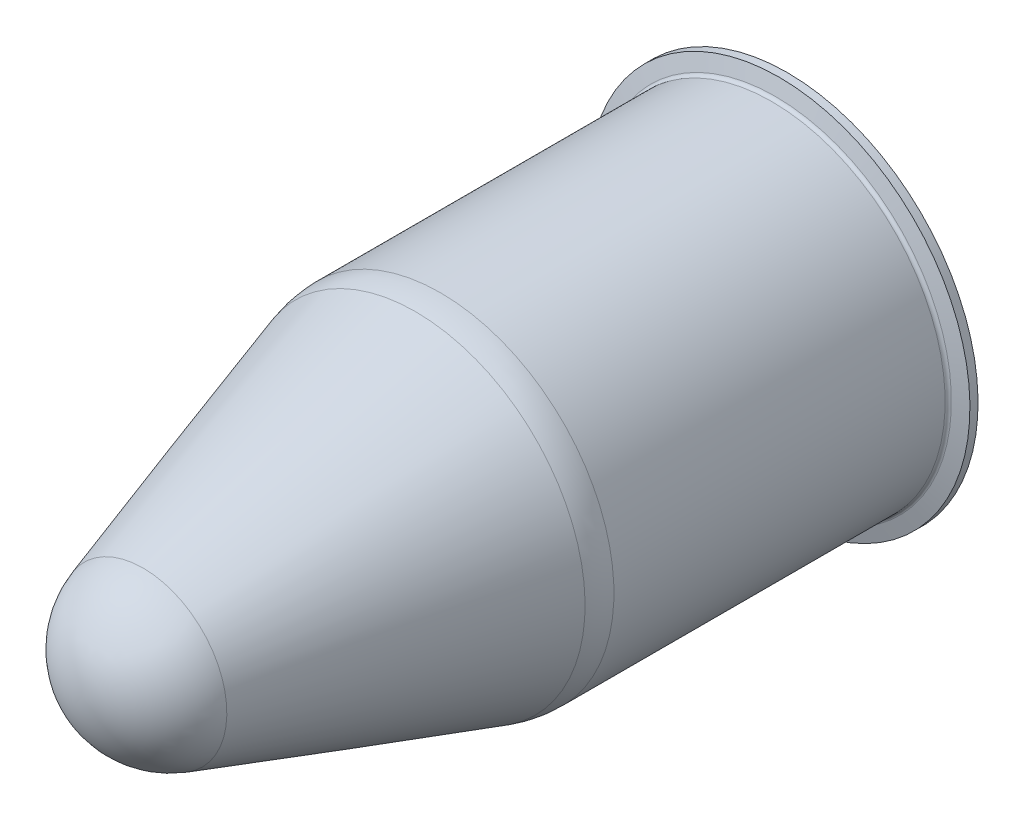
ISO-10303-21;
HEADER;
FILE_DESCRIPTION(('STEP AP214'),'2;1');
FILE_NAME('part.step','',(''),(''),'','','');
FILE_SCHEMA(('AUTOMOTIVE_DESIGN { 1 0 10303 214 1 1 1 1 }'));
ENDSEC;
DATA;
#1=APPLICATION_CONTEXT('core data for automotive mechanical design processes');
#2=APPLICATION_PROTOCOL_DEFINITION('international standard','automotive_design',2000,#1);
#3=PRODUCT_CONTEXT('',#1,'mechanical');
#4=PRODUCT('Part','Part','',(#3));
#5=PRODUCT_RELATED_PRODUCT_CATEGORY('part','',(#4));
#6=PRODUCT_DEFINITION_FORMATION('','',#4);
#7=PRODUCT_DEFINITION_CONTEXT('part definition',#1,'design');
#8=PRODUCT_DEFINITION('design','',#6,#7);
#9=PRODUCT_DEFINITION_SHAPE('','',#8);
#10=(LENGTH_UNIT() NAMED_UNIT(*) SI_UNIT(.MILLI.,.METRE.));
#11=(NAMED_UNIT(*) PLANE_ANGLE_UNIT() SI_UNIT($,.RADIAN.));
#12=(NAMED_UNIT(*) SI_UNIT($,.STERADIAN.) SOLID_ANGLE_UNIT());
#13=UNCERTAINTY_MEASURE_WITH_UNIT(LENGTH_MEASURE(1.E-05),#10,'distance_accuracy_value','');
#14=(GEOMETRIC_REPRESENTATION_CONTEXT(3) GLOBAL_UNCERTAINTY_ASSIGNED_CONTEXT((#13)) GLOBAL_UNIT_ASSIGNED_CONTEXT((#10,
#11,#12)) REPRESENTATION_CONTEXT('',''));
#15=CARTESIAN_POINT('',(0.,0.,0.));
#16=DIRECTION('',(0.,0.,1.));
#17=DIRECTION('',(1.,0.,0.));
#18=AXIS2_PLACEMENT_3D('',#15,#16,#17);
#19=CARTESIAN_POINT('',(0.,0.,300.));
#20=DIRECTION('',(0.,0.,-1.));
#21=DIRECTION('',(0.,1.,0.));
#22=AXIS2_PLACEMENT_3D('',#19,#20,#21);
#23=TOROIDAL_SURFACE('',#22,76.8658594837788,73.1341405162212);
#24=CARTESIAN_POINT('',(0.,0.,321.67437286139));
#25=DIRECTION('',(0.,0.,-1.));
#26=DIRECTION('',(0.,1.,0.));
#27=AXIS2_PLACEMENT_3D('',#24,#25,#26);
#28=CIRCLE('',#27,146.714439069275);
#29=CARTESIAN_POINT('',(0.,146.714439069275,321.67437286139));
#30=VERTEX_POINT('',#29);
#31=EDGE_CURVE('E75',#30,#30,#28,.T.);
#32=ORIENTED_EDGE('',*,*,#31,.T.);
#33=EDGE_LOOP('',(#32));
#34=FACE_BOUND('',#33,.T.);
#35=CARTESIAN_POINT('',(0.,0.,300.));
#36=DIRECTION('',(0.,0.,-1.));
#37=DIRECTION('',(0.,1.,0.));
#38=AXIS2_PLACEMENT_3D('',#35,#36,#37);
#39=CIRCLE('',#38,150.);
#40=CARTESIAN_POINT('',(0.,150.,300.));
#41=VERTEX_POINT('',#40);
#42=EDGE_CURVE('E10',#41,#41,#39,.T.);
#43=ORIENTED_EDGE('',*,*,#42,.F.);
#44=EDGE_LOOP('',(#43));
#45=FACE_BOUND('',#44,.T.);
#46=ADVANCED_FACE('F32',(#34,#45),#23,.T.);
#47=CARTESIAN_POINT('',(0.,0.,0.));
#48=DIRECTION('',(0.,0.,-1.));
#49=DIRECTION('',(0.,1.,0.));
#50=AXIS2_PLACEMENT_3D('',#47,#48,#49);
#51=CYLINDRICAL_SURFACE('',#50,150.);
#52=ORIENTED_EDGE('',*,*,#42,.T.);
#53=EDGE_LOOP('',(#52));
#54=FACE_BOUND('',#53,.T.);
#55=CARTESIAN_POINT('',(0.,0.,13.4555010732999));
#56=DIRECTION('',(0.,0.,-1.));
#57=DIRECTION('',(0.,1.,0.));
#58=AXIS2_PLACEMENT_3D('',#55,#56,#57);
#59=CIRCLE('',#58,150.);
#60=CARTESIAN_POINT('',(0.,150.,13.4555010732999));
#61=VERTEX_POINT('',#60);
#62=EDGE_CURVE('E38',#61,#61,#59,.T.);
#63=ORIENTED_EDGE('',*,*,#62,.F.);
#64=EDGE_LOOP('',(#63));
#65=FACE_BOUND('',#64,.T.);
#66=ADVANCED_FACE('F93',(#54,#65),#51,.T.);
#67=CARTESIAN_POINT('',(0.,0.,13.4555010732999));
#68=DIRECTION('',(0.,0.,-1.));
#69=DIRECTION('',(0.,1.,0.));
#70=AXIS2_PLACEMENT_3D('',#67,#68,#69);
#71=TOROIDAL_SURFACE('',#70,153.175,3.17500000000001);
#72=ORIENTED_EDGE('',*,*,#62,.T.);
#73=EDGE_LOOP('',(#72));
#74=FACE_BOUND('',#73,.T.);
#75=CARTESIAN_POINT('',(0.,0.,10.3886865748321));
#76=DIRECTION('',(0.,0.,-1.));
#77=DIRECTION('',(0.,1.,0.));
#78=AXIS2_PLACEMENT_3D('',#75,#76,#77);
#79=CIRCLE('',#78,152.3532495318);
#80=CARTESIAN_POINT('',(0.,152.3532495318,10.3886865748321));
#81=VERTEX_POINT('',#80);
#82=EDGE_CURVE('E42',#81,#81,#79,.T.);
#83=ORIENTED_EDGE('',*,*,#82,.F.);
#84=EDGE_LOOP('',(#83));
#85=FACE_BOUND('',#84,.T.);
#86=ADVANCED_FACE('F97',(#74,#85),#71,.F.);
#87=CARTESIAN_POINT('',(0.,0.,6.99999999999998));
#88=DIRECTION('',(0.,0.,-1.));
#89=DIRECTION('',(0.,1.,0.));
#90=AXIS2_PLACEMENT_3D('',#87,#88,#89);
#91=CONICAL_SURFACE('',#90,165.,1.30899693899575);
#92=ORIENTED_EDGE('',*,*,#82,.T.);
#93=EDGE_LOOP('',(#92));
#94=FACE_BOUND('',#93,.T.);
#95=CARTESIAN_POINT('',(0.,0.,6.99999999999998));
#96=DIRECTION('',(0.,0.,-1.));
#97=DIRECTION('',(0.,1.,0.));
#98=AXIS2_PLACEMENT_3D('',#95,#96,#97);
#99=CIRCLE('',#98,165.);
#100=CARTESIAN_POINT('',(0.,165.,7.));
#101=VERTEX_POINT('',#100);
#102=EDGE_CURVE('E46',#101,#101,#99,.T.);
#103=ORIENTED_EDGE('',*,*,#102,.F.);
#104=EDGE_LOOP('',(#103));
#105=FACE_BOUND('',#104,.T.);
#106=ADVANCED_FACE('F101',(#94,#105),#91,.T.);
#107=CARTESIAN_POINT('',(0.,0.,0.));
#108=DIRECTION('',(0.,0.,-1.));
#109=DIRECTION('',(0.,1.,0.));
#110=AXIS2_PLACEMENT_3D('',#107,#108,#109);
#111=CYLINDRICAL_SURFACE('',#110,165.);
#112=ORIENTED_EDGE('',*,*,#102,.T.);
#113=EDGE_LOOP('',(#112));
#114=FACE_BOUND('',#113,.T.);
#115=CARTESIAN_POINT('',(0.,0.,0.));
#116=DIRECTION('',(0.,0.,-1.));
#117=DIRECTION('',(0.,1.,0.));
#118=AXIS2_PLACEMENT_3D('',#115,#116,#117);
#119=CIRCLE('',#118,165.);
#120=CARTESIAN_POINT('',(0.,165.,0.));
#121=VERTEX_POINT('',#120);
#122=EDGE_CURVE('E51',#121,#121,#119,.T.);
#123=ORIENTED_EDGE('',*,*,#122,.F.);
#124=EDGE_LOOP('',(#123));
#125=FACE_BOUND('',#124,.T.);
#126=ADVANCED_FACE('F107',(#114,#125),#111,.T.);
#127=CARTESIAN_POINT('',(0.,145.188,0.));
#128=DIRECTION('',(0.,0.,-1.));
#129=DIRECTION('',(0.,1.,0.));
#130=AXIS2_PLACEMENT_3D('',#127,#128,#129);
#131=PLANE('',#130);
#132=ORIENTED_EDGE('',*,*,#122,.T.);
#133=EDGE_LOOP('',(#132));
#134=FACE_BOUND('',#133,.T.);
#135=CARTESIAN_POINT('',(0.,0.,0.));
#136=DIRECTION('',(0.,0.,-1.));
#137=DIRECTION('',(0.,1.,0.));
#138=AXIS2_PLACEMENT_3D('',#135,#136,#137);
#139=CIRCLE('',#138,145.188);
#140=CARTESIAN_POINT('',(0.,145.188,0.));
#141=VERTEX_POINT('',#140);
#142=EDGE_CURVE('E54',#141,#141,#139,.T.);
#143=ORIENTED_EDGE('',*,*,#142,.F.);
#144=EDGE_LOOP('',(#143));
#145=FACE_BOUND('',#144,.T.);
#146=ADVANCED_FACE('F111',(#134,#145),#131,.T.);
#147=CARTESIAN_POINT('',(0.,0.,0.));
#148=DIRECTION('',(0.,0.,-1.));
#149=DIRECTION('',(0.,1.,0.));
#150=AXIS2_PLACEMENT_3D('',#147,#148,#149);
#151=CYLINDRICAL_SURFACE('',#150,145.188);
#152=ORIENTED_EDGE('',*,*,#142,.T.);
#153=EDGE_LOOP('',(#152));
#154=FACE_BOUND('',#153,.T.);
#155=CARTESIAN_POINT('',(0.,0.,6.99999999999998));
#156=DIRECTION('',(0.,0.,-1.));
#157=DIRECTION('',(0.,1.,0.));
#158=AXIS2_PLACEMENT_3D('',#155,#156,#157);
#159=CIRCLE('',#158,145.188);
#160=CARTESIAN_POINT('',(0.,145.188,7.));
#161=VERTEX_POINT('',#160);
#162=EDGE_CURVE('E57',#161,#161,#159,.T.);
#163=ORIENTED_EDGE('',*,*,#162,.F.);
#164=EDGE_LOOP('',(#163));
#165=FACE_BOUND('',#164,.T.);
#166=ADVANCED_FACE('F115',(#154,#165),#151,.F.);
#167=CARTESIAN_POINT('',(0.,0.,10.3886865748321));
#168=DIRECTION('',(0.,0.,-1.));
#169=DIRECTION('',(0.,1.,0.));
#170=AXIS2_PLACEMENT_3D('',#167,#168,#169);
#171=CONICAL_SURFACE('',#170,145.,0.0554219076487213);
#172=ORIENTED_EDGE('',*,*,#162,.T.);
#173=EDGE_LOOP('',(#172));
#174=FACE_BOUND('',#173,.T.);
#175=CARTESIAN_POINT('',(0.,0.,10.3886865748321));
#176=DIRECTION('',(0.,0.,-1.));
#177=DIRECTION('',(0.,1.,0.));
#178=AXIS2_PLACEMENT_3D('',#175,#176,#177);
#179=CIRCLE('',#178,145.);
#180=CARTESIAN_POINT('',(0.,145.,10.3886865748321));
#181=VERTEX_POINT('',#180);
#182=EDGE_CURVE('E60',#181,#181,#179,.T.);
#183=ORIENTED_EDGE('',*,*,#182,.F.);
#184=EDGE_LOOP('',(#183));
#185=FACE_BOUND('',#184,.T.);
#186=ADVANCED_FACE('F119',(#174,#185),#171,.F.);
#187=CARTESIAN_POINT('',(0.,0.,0.));
#188=DIRECTION('',(0.,0.,-1.));
#189=DIRECTION('',(0.,1.,0.));
#190=AXIS2_PLACEMENT_3D('',#187,#188,#189);
#191=CYLINDRICAL_SURFACE('',#190,145.);
#192=ORIENTED_EDGE('',*,*,#182,.T.);
#193=EDGE_LOOP('',(#192));
#194=FACE_BOUND('',#193,.T.);
#195=CARTESIAN_POINT('',(0.,0.,300.154164533949));
#196=DIRECTION('',(0.,0.,-1.));
#197=DIRECTION('',(0.,1.,0.));
#198=AXIS2_PLACEMENT_3D('',#195,#196,#197);
#199=CIRCLE('',#198,145.);
#200=CARTESIAN_POINT('',(0.,145.,300.154164533949));
#201=VERTEX_POINT('',#200);
#202=EDGE_CURVE('E63',#201,#201,#199,.T.);
#203=ORIENTED_EDGE('',*,*,#202,.F.);
#204=EDGE_LOOP('',(#203));
#205=FACE_BOUND('',#204,.T.);
#206=ADVANCED_FACE('F123',(#194,#205),#191,.F.);
#207=CARTESIAN_POINT('',(0.,0.,300.154164533949));
#208=DIRECTION('',(0.,0.,-1.));
#209=DIRECTION('',(0.,1.,0.));
#210=AXIS2_PLACEMENT_3D('',#207,#208,#209);
#211=DEGENERATE_TOROIDAL_SURFACE('',#210,68.8,76.2,.T.);
#212=ORIENTED_EDGE('',*,*,#202,.T.);
#213=EDGE_LOOP('',(#212));
#214=FACE_BOUND('',#213,.T.);
#215=CARTESIAN_POINT('',(0.,0.,321.674372861389));
#216=DIRECTION('',(0.,0.,-1.));
#217=DIRECTION('',(0.,1.,0.));
#218=AXIS2_PLACEMENT_3D('',#215,#216,#217);
#219=CIRCLE('',#218,141.898020722476);
#220=CARTESIAN_POINT('',(0.,141.898020722476,321.674372861389));
#221=VERTEX_POINT('',#220);
#222=EDGE_CURVE('E66',#221,#221,#219,.T.);
#223=ORIENTED_EDGE('',*,*,#222,.F.);
#224=EDGE_LOOP('',(#223));
#225=FACE_BOUND('',#224,.T.);
#226=ADVANCED_FACE('F127',(#214,#225),#211,.F.);
#227=CARTESIAN_POINT('',(0.,0.,-6851.72840295203));
#228=DIRECTION('',(0.,0.,-1.));
#229=DIRECTION('',(0.,1.,0.));
#230=AXIS2_PLACEMENT_3D('',#227,#228,#229);
#231=DEGENERATE_TOROIDAL_SURFACE('',#230,24224.1088867696,25400.,.F.);
#232=ORIENTED_EDGE('',*,*,#222,.T.);
#233=EDGE_LOOP('',(#232));
#234=FACE_BOUND('',#233,.T.);
#235=CARTESIAN_POINT('',(0.,0.,555.868158289369));
#236=DIRECTION('',(0.,0.,-1.));
#237=DIRECTION('',(0.,1.,0.));
#238=AXIS2_PLACEMENT_3D('',#235,#236,#237);
#239=CIRCLE('',#238,71.7243606389673);
#240=CARTESIAN_POINT('',(0.,71.7243606389673,555.868158289369));
#241=VERTEX_POINT('',#240);
#242=EDGE_CURVE('E69',#241,#241,#239,.T.);
#243=ORIENTED_EDGE('',*,*,#242,.F.);
#244=EDGE_LOOP('',(#243));
#245=FACE_BOUND('',#244,.T.);
#246=ADVANCED_FACE('F131',(#234,#245),#231,.T.);
#247=CARTESIAN_POINT('',(0.,1.55778942253708E-13,534.));
#248=DIRECTION('',(0.,0.,-1.));
#249=DIRECTION('',(0.,-1.,0.));
#250=AXIS2_PLACEMENT_3D('',#247,#248,#249);
#251=SPHERICAL_SURFACE('',#250,74.9840000002511);
#252=ORIENTED_EDGE('',*,*,#242,.T.);
#253=EDGE_LOOP('',(#252));
#254=FACE_BOUND('',#253,.T.);
#255=ADVANCED_FACE('F89',(#254),#251,.F.);
#256=CARTESIAN_POINT('',(0.,1.55778942253708E-13,534.));
#257=DIRECTION('',(0.,0.,-1.));
#258=DIRECTION('',(0.,1.,0.));
#259=AXIS2_PLACEMENT_3D('',#256,#257,#258);
#260=SPHERICAL_SURFACE('',#259,75.999999999998);
#261=CARTESIAN_POINT('',(0.,0.,557.228519945498));
#262=DIRECTION('',(0.,0.,-1.));
#263=DIRECTION('',(0.,1.,0.));
#264=AXIS2_PLACEMENT_3D('',#261,#262,#263);
#265=CIRCLE('',#264,72.363221743793);
#266=CARTESIAN_POINT('',(0.,72.363221743793,557.228519945498));
#267=VERTEX_POINT('',#266);
#268=EDGE_CURVE('E72',#267,#267,#265,.T.);
#269=ORIENTED_EDGE('',*,*,#268,.F.);
#270=EDGE_LOOP('',(#269));
#271=FACE_BOUND('',#270,.T.);
#272=ADVANCED_FACE('F83',(#271),#260,.T.);
#273=CARTESIAN_POINT('',(0.,0.,-7205.98735657622));
#274=DIRECTION('',(0.,0.,-1.));
#275=DIRECTION('',(0.,1.,0.));
#276=AXIS2_PLACEMENT_3D('',#273,#274,#275);
#277=DEGENERATE_TOROIDAL_SURFACE('',#276,24112.187203156,25400.,.F.);
#278=ORIENTED_EDGE('',*,*,#268,.T.);
#279=EDGE_LOOP('',(#278));
#280=FACE_BOUND('',#279,.T.);
#281=ORIENTED_EDGE('',*,*,#31,.F.);
#282=EDGE_LOOP('',(#281));
#283=FACE_BOUND('',#282,.T.);
#284=ADVANCED_FACE('F81',(#280,#283),#277,.F.);
#285=CLOSED_SHELL('',(#46,#66,#86,#106,#126,#146,#166,#186,#206,#226,#246,#255,#272,#284));
#286=MANIFOLD_SOLID_BREP('B2',#285);
#287=ADVANCED_BREP_SHAPE_REPRESENTATION('',(#18,#286),#14);
#288=SHAPE_DEFINITION_REPRESENTATION(#9,#287);
ENDSEC;
END-ISO-10303-21;
